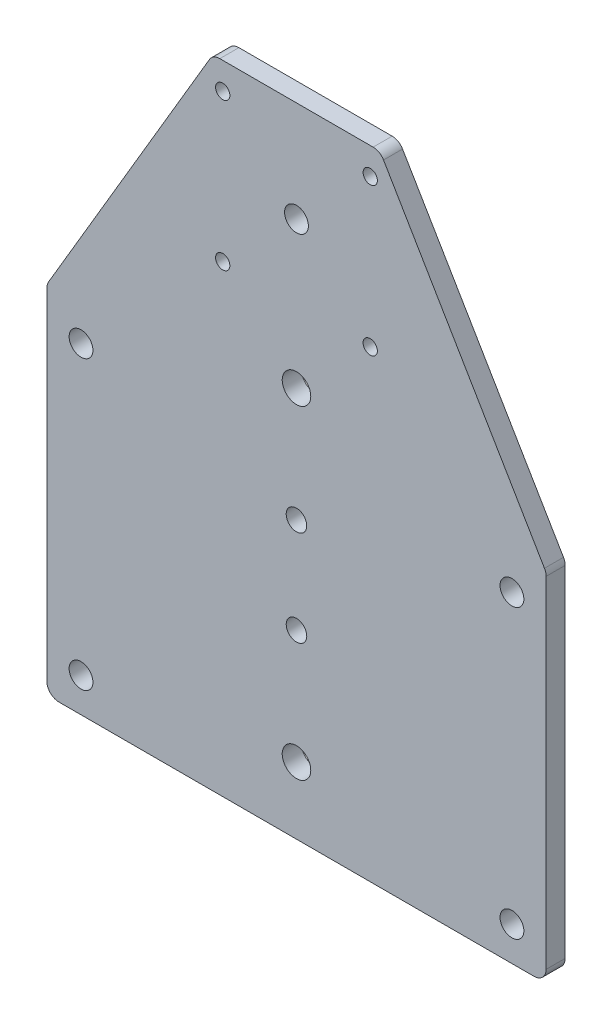
ISO-10303-21;
HEADER;
FILE_DESCRIPTION(('STEP AP214'),'2;1');
FILE_NAME('part.step','',(''),(''),'','','');
FILE_SCHEMA(('AUTOMOTIVE_DESIGN { 1 0 10303 214 1 1 1 1 }'));
ENDSEC;
DATA;
#1=APPLICATION_CONTEXT('core data for automotive mechanical design processes');
#2=APPLICATION_PROTOCOL_DEFINITION('international standard','automotive_design',2000,#1);
#3=PRODUCT_CONTEXT('',#1,'mechanical');
#4=PRODUCT('Part','Part','',(#3));
#5=PRODUCT_RELATED_PRODUCT_CATEGORY('part','',(#4));
#6=PRODUCT_DEFINITION_FORMATION('','',#4);
#7=PRODUCT_DEFINITION_CONTEXT('part definition',#1,'design');
#8=PRODUCT_DEFINITION('design','',#6,#7);
#9=PRODUCT_DEFINITION_SHAPE('','',#8);
#10=(LENGTH_UNIT() NAMED_UNIT(*) SI_UNIT(.MILLI.,.METRE.));
#11=(NAMED_UNIT(*) PLANE_ANGLE_UNIT() SI_UNIT($,.RADIAN.));
#12=(NAMED_UNIT(*) SI_UNIT($,.STERADIAN.) SOLID_ANGLE_UNIT());
#13=UNCERTAINTY_MEASURE_WITH_UNIT(LENGTH_MEASURE(1.E-05),#10,'distance_accuracy_value','');
#14=(GEOMETRIC_REPRESENTATION_CONTEXT(3) GLOBAL_UNCERTAINTY_ASSIGNED_CONTEXT((#13)) GLOBAL_UNIT_ASSIGNED_CONTEXT((#10,
#11,#12)) REPRESENTATION_CONTEXT('',''));
#15=CARTESIAN_POINT('',(0.,0.,0.));
#16=DIRECTION('',(0.,0.,1.));
#17=DIRECTION('',(1.,0.,0.));
#18=AXIS2_PLACEMENT_3D('',#15,#16,#17);
#19=CARTESIAN_POINT('',(0.,0.,4.));
#20=DIRECTION('',(0.,0.,1.));
#21=DIRECTION('',(1.,0.,0.));
#22=AXIS2_PLACEMENT_3D('',#19,#20,#21);
#23=PLANE('',#22);
#24=CARTESIAN_POINT('',(0.,-74.8337421354534,4.));
#25=DIRECTION('',(0.,0.,1.));
#26=DIRECTION('',(1.,0.,0.));
#27=AXIS2_PLACEMENT_3D('',#24,#25,#26);
#28=CIRCLE('',#27,2.15900000000001);
#29=CARTESIAN_POINT('',(2.15900000000001,-74.8337421354534,4.));
#30=VERTEX_POINT('',#29);
#31=EDGE_CURVE('E657',#30,#30,#28,.F.);
#32=ORIENTED_EDGE('',*,*,#31,.T.);
#33=EDGE_LOOP('',(#32));
#34=FACE_BOUND('',#33,.T.);
#35=CARTESIAN_POINT('',(0.,-54.7677421354534,4.));
#36=DIRECTION('',(0.,0.,1.));
#37=DIRECTION('',(1.,0.,0.));
#38=AXIS2_PLACEMENT_3D('',#35,#36,#37);
#39=CIRCLE('',#38,2.15900000000001);
#40=CARTESIAN_POINT('',(2.15900000000001,-54.7677421354534,4.));
#41=VERTEX_POINT('',#40);
#42=EDGE_CURVE('E654',#41,#41,#39,.T.);
#43=ORIENTED_EDGE('',*,*,#42,.F.);
#44=EDGE_LOOP('',(#43));
#45=FACE_BOUND('',#44,.T.);
#46=CARTESIAN_POINT('',(-45.2837421354535,-105.683742135453,4.));
#47=DIRECTION('',(0.,0.,1.));
#48=DIRECTION('',(1.,0.,0.));
#49=AXIS2_PLACEMENT_3D('',#46,#47,#48);
#50=CIRCLE('',#49,2.5);
#51=CARTESIAN_POINT('',(-42.7837421354535,-105.683742135453,4.));
#52=VERTEX_POINT('',#51);
#53=EDGE_CURVE('E214',#52,#52,#50,.F.);
#54=ORIENTED_EDGE('',*,*,#53,.T.);
#55=EDGE_LOOP('',(#54));
#56=FACE_BOUND('',#55,.T.);
#57=CARTESIAN_POINT('',(45.2837421354535,-105.683742135453,4.));
#58=DIRECTION('',(0.,0.,1.));
#59=DIRECTION('',(1.,0.,0.));
#60=AXIS2_PLACEMENT_3D('',#57,#58,#59);
#61=CIRCLE('',#60,2.50000000000002);
#62=CARTESIAN_POINT('',(47.7837421354536,-105.683742135453,4.));
#63=VERTEX_POINT('',#62);
#64=EDGE_CURVE('E322',#63,#63,#61,.T.);
#65=ORIENTED_EDGE('',*,*,#64,.F.);
#66=EDGE_LOOP('',(#65));
#67=FACE_BOUND('',#66,.T.);
#68=CARTESIAN_POINT('',(45.2837421354535,-45.2837421354535,4.));
#69=DIRECTION('',(0.,0.,1.));
#70=DIRECTION('',(1.,0.,0.));
#71=AXIS2_PLACEMENT_3D('',#68,#69,#70);
#72=CIRCLE('',#71,2.50000000000002);
#73=CARTESIAN_POINT('',(47.7837421354536,-45.2837421354535,4.));
#74=VERTEX_POINT('',#73);
#75=EDGE_CURVE('E318',#74,#74,#72,.F.);
#76=ORIENTED_EDGE('',*,*,#75,.T.);
#77=EDGE_LOOP('',(#76));
#78=FACE_BOUND('',#77,.T.);
#79=CARTESIAN_POINT('',(-45.2837421354535,-45.2837421354535,4.));
#80=DIRECTION('',(0.,0.,1.));
#81=DIRECTION('',(1.,0.,0.));
#82=AXIS2_PLACEMENT_3D('',#79,#80,#81);
#83=CIRCLE('',#82,2.5);
#84=CARTESIAN_POINT('',(-42.7837421354535,-45.2837421354535,4.));
#85=VERTEX_POINT('',#84);
#86=EDGE_CURVE('E314',#85,#85,#83,.T.);
#87=ORIENTED_EDGE('',*,*,#86,.F.);
#88=EDGE_LOOP('',(#87));
#89=FACE_BOUND('',#88,.T.);
#90=DIRECTION('',(0.507639890212221,0.861569348262416,0.));
#91=VECTOR('',#90,1.);
#92=CARTESIAN_POINT('',(-22.2835693380345,13.1295626000506,4.));
#93=LINE('',#92,#91);
#94=CARTESIAN_POINT('',(-52.1163331768954,-37.5027761761018,4.));
#95=VERTEX_POINT('',#94);
#96=CARTESIAN_POINT('',(-18.2947526251161,19.899405321139,4.));
#97=VERTEX_POINT('',#96);
#98=EDGE_CURVE('E293',#95,#97,#93,.T.);
#99=ORIENTED_EDGE('',*,*,#98,.F.);
#100=CARTESIAN_POINT('',(-49.9279470323089,-38.7921814972409,4.));
#101=DIRECTION('',(0.,0.,1.));
#102=DIRECTION('',(1.,0.,0.));
#103=AXIS2_PLACEMENT_3D('',#100,#101,#102);
#104=CIRCLE('',#103,2.54);
#105=CARTESIAN_POINT('',(-52.4679470323089,-38.7921814972409,4.));
#106=VERTEX_POINT('',#105);
#107=EDGE_CURVE('E250',#95,#106,#104,.T.);
#108=ORIENTED_EDGE('',*,*,#107,.T.);
#109=DIRECTION('',(0.,-1.,0.));
#110=VECTOR('',#109,1.);
#111=CARTESIAN_POINT('',(-52.4679470323089,0.,4.));
#112=LINE('',#111,#110);
#113=CARTESIAN_POINT('',(-52.4679470323089,-110.327947032309,4.));
#114=VERTEX_POINT('',#113);
#115=EDGE_CURVE('E158',#106,#114,#112,.T.);
#116=ORIENTED_EDGE('',*,*,#115,.T.);
#117=CARTESIAN_POINT('',(-49.9279470323089,-110.327947032309,4.));
#118=DIRECTION('',(0.,0.,1.));
#119=DIRECTION('',(1.,0.,0.));
#120=AXIS2_PLACEMENT_3D('',#117,#118,#119);
#121=CIRCLE('',#120,2.54);
#122=CARTESIAN_POINT('',(-49.9279470323089,-112.867947032309,4.));
#123=VERTEX_POINT('',#122);
#124=EDGE_CURVE('E247',#114,#123,#121,.T.);
#125=ORIENTED_EDGE('',*,*,#124,.T.);
#126=DIRECTION('',(1.,0.,0.));
#127=VECTOR('',#126,1.);
#128=CARTESIAN_POINT('',(0.,-112.867947032309,4.));
#129=LINE('',#128,#127);
#130=CARTESIAN_POINT('',(49.9279470323089,-112.867947032309,4.));
#131=VERTEX_POINT('',#130);
#132=EDGE_CURVE('E308',#123,#131,#129,.T.);
#133=ORIENTED_EDGE('',*,*,#132,.T.);
#134=CARTESIAN_POINT('',(49.9279470323089,-110.327947032309,4.));
#135=DIRECTION('',(0.,0.,1.));
#136=DIRECTION('',(1.,0.,0.));
#137=AXIS2_PLACEMENT_3D('',#134,#135,#136);
#138=CIRCLE('',#137,2.54);
#139=CARTESIAN_POINT('',(52.4679470323089,-110.327947032309,4.));
#140=VERTEX_POINT('',#139);
#141=EDGE_CURVE('E244',#131,#140,#138,.T.);
#142=ORIENTED_EDGE('',*,*,#141,.T.);
#143=DIRECTION('',(0.,-1.,0.));
#144=VECTOR('',#143,1.);
#145=CARTESIAN_POINT('',(52.4679470323089,0.,4.));
#146=LINE('',#145,#144);
#147=CARTESIAN_POINT('',(52.4679470323089,-38.7921814972409,4.));
#148=VERTEX_POINT('',#147);
#149=EDGE_CURVE('E304',#148,#140,#146,.T.);
#150=ORIENTED_EDGE('',*,*,#149,.F.);
#151=CARTESIAN_POINT('',(49.9279470323089,-38.7921814972409,4.));
#152=DIRECTION('',(0.,0.,1.));
#153=DIRECTION('',(1.,0.,0.));
#154=AXIS2_PLACEMENT_3D('',#151,#152,#153);
#155=CIRCLE('',#154,2.54);
#156=CARTESIAN_POINT('',(52.1163331768954,-37.5027761761018,4.));
#157=VERTEX_POINT('',#156);
#158=EDGE_CURVE('E241',#148,#157,#155,.T.);
#159=ORIENTED_EDGE('',*,*,#158,.T.);
#160=DIRECTION('',(0.507639890212221,-0.861569348262416,0.));
#161=VECTOR('',#160,1.);
#162=CARTESIAN_POINT('',(22.2835693380345,13.1295626000506,4.));
#163=LINE('',#162,#161);
#164=CARTESIAN_POINT('',(18.2947526251161,19.899405321139,4.));
#165=VERTEX_POINT('',#164);
#166=EDGE_CURVE('E300',#165,#157,#163,.T.);
#167=ORIENTED_EDGE('',*,*,#166,.F.);
#168=CARTESIAN_POINT('',(16.1063664805295,18.61,4.));
#169=DIRECTION('',(0.,0.,1.));
#170=DIRECTION('',(1.,0.,0.));
#171=AXIS2_PLACEMENT_3D('',#168,#169,#170);
#172=CIRCLE('',#171,2.54);
#173=CARTESIAN_POINT('',(16.1063664805295,21.15,4.));
#174=VERTEX_POINT('',#173);
#175=EDGE_CURVE('E62',#165,#174,#172,.T.);
#176=ORIENTED_EDGE('',*,*,#175,.T.);
#177=DIRECTION('',(1.,0.,0.));
#178=VECTOR('',#177,1.);
#179=CARTESIAN_POINT('',(0.,21.15,4.));
#180=LINE('',#179,#178);
#181=CARTESIAN_POINT('',(-16.1063664805295,21.15,4.));
#182=VERTEX_POINT('',#181);
#183=EDGE_CURVE('E297',#182,#174,#180,.T.);
#184=ORIENTED_EDGE('',*,*,#183,.F.);
#185=CARTESIAN_POINT('',(-16.1063664805295,18.61,4.));
#186=DIRECTION('',(0.,0.,1.));
#187=DIRECTION('',(1.,0.,0.));
#188=AXIS2_PLACEMENT_3D('',#185,#186,#187);
#189=CIRCLE('',#188,2.54);
#190=EDGE_CURVE('E236',#182,#97,#189,.T.);
#191=ORIENTED_EDGE('',*,*,#190,.T.);
#192=EDGE_LOOP('',(#99,#108,#116,#125,#133,#142,#150,#159,#167,#176,#184,#191));
#193=FACE_BOUND('',#192,.T.);
#194=CARTESIAN_POINT('',(0.,0.,4.));
#195=DIRECTION('',(0.,0.,1.));
#196=DIRECTION('',(1.,0.,0.));
#197=AXIS2_PLACEMENT_3D('',#194,#195,#196);
#198=CIRCLE('',#197,2.5);
#199=CARTESIAN_POINT('',(2.50000000000001,0.,4.));
#200=VERTEX_POINT('',#199);
#201=EDGE_CURVE('E289',#200,#200,#198,.T.);
#202=ORIENTED_EDGE('',*,*,#201,.F.);
#203=EDGE_LOOP('',(#202));
#204=FACE_BOUND('',#203,.T.);
#205=CARTESIAN_POINT('',(15.5,-15.5,4.));
#206=DIRECTION('',(0.,0.,1.));
#207=DIRECTION('',(1.,0.,0.));
#208=AXIS2_PLACEMENT_3D('',#205,#206,#207);
#209=CIRCLE('',#208,1.5);
#210=CARTESIAN_POINT('',(17.,-15.5,4.));
#211=VERTEX_POINT('',#210);
#212=EDGE_CURVE('E285',#211,#211,#209,.T.);
#213=ORIENTED_EDGE('',*,*,#212,.F.);
#214=EDGE_LOOP('',(#213));
#215=FACE_BOUND('',#214,.T.);
#216=CARTESIAN_POINT('',(15.5,15.5,4.));
#217=DIRECTION('',(0.,0.,1.));
#218=DIRECTION('',(1.,0.,0.));
#219=AXIS2_PLACEMENT_3D('',#216,#217,#218);
#220=CIRCLE('',#219,1.5);
#221=CARTESIAN_POINT('',(17.,15.5,4.));
#222=VERTEX_POINT('',#221);
#223=EDGE_CURVE('E281',#222,#222,#220,.T.);
#224=ORIENTED_EDGE('',*,*,#223,.F.);
#225=EDGE_LOOP('',(#224));
#226=FACE_BOUND('',#225,.T.);
#227=CARTESIAN_POINT('',(-15.5,15.5,4.));
#228=DIRECTION('',(0.,0.,1.));
#229=DIRECTION('',(1.,0.,0.));
#230=AXIS2_PLACEMENT_3D('',#227,#228,#229);
#231=CIRCLE('',#230,1.5);
#232=CARTESIAN_POINT('',(-14.,15.5,4.));
#233=VERTEX_POINT('',#232);
#234=EDGE_CURVE('E277',#233,#233,#231,.T.);
#235=ORIENTED_EDGE('',*,*,#234,.F.);
#236=EDGE_LOOP('',(#235));
#237=FACE_BOUND('',#236,.T.);
#238=CARTESIAN_POINT('',(-15.5,-15.5,4.));
#239=DIRECTION('',(0.,0.,1.));
#240=DIRECTION('',(1.,0.,0.));
#241=AXIS2_PLACEMENT_3D('',#238,#239,#240);
#242=CIRCLE('',#241,1.5);
#243=CARTESIAN_POINT('',(-14.,-15.5,4.));
#244=VERTEX_POINT('',#243);
#245=EDGE_CURVE('E216',#244,#244,#242,.T.);
#246=ORIENTED_EDGE('',*,*,#245,.F.);
#247=EDGE_LOOP('',(#246));
#248=FACE_BOUND('',#247,.T.);
#249=CARTESIAN_POINT('',(0.,-30.7677421354534,4.));
#250=DIRECTION('',(0.,0.,1.));
#251=DIRECTION('',(1.,0.,0.));
#252=AXIS2_PLACEMENT_3D('',#249,#250,#251);
#253=CIRCLE('',#252,3.);
#254=CARTESIAN_POINT('',(3.,-30.7677421354534,4.));
#255=VERTEX_POINT('',#254);
#256=EDGE_CURVE('E638',#255,#255,#253,.T.);
#257=ORIENTED_EDGE('',*,*,#256,.F.);
#258=EDGE_LOOP('',(#257));
#259=FACE_BOUND('',#258,.T.);
#260=CARTESIAN_POINT('',(0.,-98.8337421354535,4.));
#261=DIRECTION('',(0.,0.,1.));
#262=DIRECTION('',(1.,0.,0.));
#263=AXIS2_PLACEMENT_3D('',#260,#261,#262);
#264=CIRCLE('',#263,3.);
#265=CARTESIAN_POINT('',(3.,-98.8337421354535,4.));
#266=VERTEX_POINT('',#265);
#267=EDGE_CURVE('E641',#266,#266,#264,.F.);
#268=ORIENTED_EDGE('',*,*,#267,.T.);
#269=EDGE_LOOP('',(#268));
#270=FACE_BOUND('',#269,.T.);
#271=ADVANCED_FACE('F46',(#34,#45,#56,#67,#78,#89,#193,#204,#215,#226,#237,#248,#259,#270),#23,.T.);
#272=CARTESIAN_POINT('',(0.,0.,0.));
#273=DIRECTION('',(0.,0.,1.));
#274=DIRECTION('',(1.,0.,0.));
#275=AXIS2_PLACEMENT_3D('',#272,#273,#274);
#276=PLANE('',#275);
#277=CARTESIAN_POINT('',(0.,-30.7677421354534,0.));
#278=DIRECTION('',(0.,0.,1.));
#279=DIRECTION('',(1.,0.,0.));
#280=AXIS2_PLACEMENT_3D('',#277,#278,#279);
#281=CIRCLE('',#280,3.);
#282=CARTESIAN_POINT('',(3.,-30.7677421354534,0.));
#283=VERTEX_POINT('',#282);
#284=EDGE_CURVE('E644',#283,#283,#281,.F.);
#285=ORIENTED_EDGE('',*,*,#284,.F.);
#286=EDGE_LOOP('',(#285));
#287=FACE_BOUND('',#286,.T.);
#288=CARTESIAN_POINT('',(0.,-54.7677421354534,0.));
#289=DIRECTION('',(0.,0.,1.));
#290=DIRECTION('',(1.,0.,0.));
#291=AXIS2_PLACEMENT_3D('',#288,#289,#290);
#292=CIRCLE('',#291,2.15900000000001);
#293=CARTESIAN_POINT('',(2.15900000000001,-54.7677421354534,0.));
#294=VERTEX_POINT('',#293);
#295=EDGE_CURVE('E332',#294,#294,#292,.F.);
#296=ORIENTED_EDGE('',*,*,#295,.F.);
#297=EDGE_LOOP('',(#296));
#298=FACE_BOUND('',#297,.T.);
#299=CARTESIAN_POINT('',(-45.2837421354535,-105.683742135453,0.));
#300=DIRECTION('',(0.,0.,1.));
#301=DIRECTION('',(1.,0.,0.));
#302=AXIS2_PLACEMENT_3D('',#299,#300,#301);
#303=CIRCLE('',#302,2.5);
#304=CARTESIAN_POINT('',(-42.7837421354535,-105.683742135453,0.));
#305=VERTEX_POINT('',#304);
#306=EDGE_CURVE('E335',#305,#305,#303,.F.);
#307=ORIENTED_EDGE('',*,*,#306,.F.);
#308=EDGE_LOOP('',(#307));
#309=FACE_BOUND('',#308,.T.);
#310=CARTESIAN_POINT('',(45.2837421354535,-105.683742135453,0.));
#311=DIRECTION('',(0.,0.,1.));
#312=DIRECTION('',(1.,0.,0.));
#313=AXIS2_PLACEMENT_3D('',#310,#311,#312);
#314=CIRCLE('',#313,2.50000000000002);
#315=CARTESIAN_POINT('',(47.7837421354536,-105.683742135453,0.));
#316=VERTEX_POINT('',#315);
#317=EDGE_CURVE('E339',#316,#316,#314,.T.);
#318=ORIENTED_EDGE('',*,*,#317,.T.);
#319=EDGE_LOOP('',(#318));
#320=FACE_BOUND('',#319,.T.);
#321=CARTESIAN_POINT('',(45.2837421354535,-45.2837421354535,0.));
#322=DIRECTION('',(0.,0.,1.));
#323=DIRECTION('',(1.,0.,0.));
#324=AXIS2_PLACEMENT_3D('',#321,#322,#323);
#325=CIRCLE('',#324,2.50000000000002);
#326=CARTESIAN_POINT('',(47.7837421354536,-45.2837421354535,0.));
#327=VERTEX_POINT('',#326);
#328=EDGE_CURVE('E176',#327,#327,#325,.F.);
#329=ORIENTED_EDGE('',*,*,#328,.F.);
#330=EDGE_LOOP('',(#329));
#331=FACE_BOUND('',#330,.T.);
#332=CARTESIAN_POINT('',(-45.2837421354535,-45.2837421354535,0.));
#333=DIRECTION('',(0.,0.,1.));
#334=DIRECTION('',(1.,0.,0.));
#335=AXIS2_PLACEMENT_3D('',#332,#333,#334);
#336=CIRCLE('',#335,2.5);
#337=CARTESIAN_POINT('',(-42.7837421354535,-45.2837421354535,0.));
#338=VERTEX_POINT('',#337);
#339=EDGE_CURVE('E168',#338,#338,#336,.T.);
#340=ORIENTED_EDGE('',*,*,#339,.T.);
#341=EDGE_LOOP('',(#340));
#342=FACE_BOUND('',#341,.T.);
#343=DIRECTION('',(0.,-1.,0.));
#344=VECTOR('',#343,1.);
#345=CARTESIAN_POINT('',(-52.4679470323089,0.,0.));
#346=LINE('',#345,#344);
#347=CARTESIAN_POINT('',(-52.4679470323089,-38.7921814972409,0.));
#348=VERTEX_POINT('',#347);
#349=CARTESIAN_POINT('',(-52.4679470323089,-110.327947032309,0.));
#350=VERTEX_POINT('',#349);
#351=EDGE_CURVE('E155',#348,#350,#346,.T.);
#352=ORIENTED_EDGE('',*,*,#351,.F.);
#353=CARTESIAN_POINT('',(-49.9279470323089,-38.7921814972409,0.));
#354=DIRECTION('',(0.,0.,1.));
#355=DIRECTION('',(1.,0.,0.));
#356=AXIS2_PLACEMENT_3D('',#353,#354,#355);
#357=CIRCLE('',#356,2.54);
#358=CARTESIAN_POINT('',(-52.1163331768954,-37.5027761761018,0.));
#359=VERTEX_POINT('',#358);
#360=EDGE_CURVE('E137',#348,#359,#357,.F.);
#361=ORIENTED_EDGE('',*,*,#360,.T.);
#362=DIRECTION('',(0.507639890212221,0.861569348262416,0.));
#363=VECTOR('',#362,1.);
#364=CARTESIAN_POINT('',(-22.2835693380345,13.1295626000506,0.));
#365=LINE('',#364,#363);
#366=CARTESIAN_POINT('',(-18.2947526251161,19.899405321139,0.));
#367=VERTEX_POINT('',#366);
#368=EDGE_CURVE('E191',#359,#367,#365,.T.);
#369=ORIENTED_EDGE('',*,*,#368,.T.);
#370=CARTESIAN_POINT('',(-16.1063664805295,18.61,0.));
#371=DIRECTION('',(0.,0.,1.));
#372=DIRECTION('',(1.,0.,0.));
#373=AXIS2_PLACEMENT_3D('',#370,#371,#372);
#374=CIRCLE('',#373,2.54);
#375=CARTESIAN_POINT('',(-16.1063664805295,21.15,0.));
#376=VERTEX_POINT('',#375);
#377=EDGE_CURVE('E160',#367,#376,#374,.F.);
#378=ORIENTED_EDGE('',*,*,#377,.T.);
#379=DIRECTION('',(1.,0.,0.));
#380=VECTOR('',#379,1.);
#381=CARTESIAN_POINT('',(0.,21.15,0.));
#382=LINE('',#381,#380);
#383=CARTESIAN_POINT('',(16.1063664805295,21.15,0.));
#384=VERTEX_POINT('',#383);
#385=EDGE_CURVE('E187',#376,#384,#382,.T.);
#386=ORIENTED_EDGE('',*,*,#385,.T.);
#387=CARTESIAN_POINT('',(16.1063664805295,18.61,0.));
#388=DIRECTION('',(0.,0.,1.));
#389=DIRECTION('',(1.,0.,0.));
#390=AXIS2_PLACEMENT_3D('',#387,#388,#389);
#391=CIRCLE('',#390,2.54);
#392=CARTESIAN_POINT('',(18.2947526251161,19.899405321139,0.));
#393=VERTEX_POINT('',#392);
#394=EDGE_CURVE('E220',#384,#393,#391,.F.);
#395=ORIENTED_EDGE('',*,*,#394,.T.);
#396=DIRECTION('',(0.507639890212221,-0.861569348262416,0.));
#397=VECTOR('',#396,1.);
#398=CARTESIAN_POINT('',(22.2835693380345,13.1295626000506,0.));
#399=LINE('',#398,#397);
#400=CARTESIAN_POINT('',(52.1163331768954,-37.5027761761018,0.));
#401=VERTEX_POINT('',#400);
#402=EDGE_CURVE('E183',#393,#401,#399,.T.);
#403=ORIENTED_EDGE('',*,*,#402,.T.);
#404=CARTESIAN_POINT('',(49.9279470323089,-38.7921814972409,0.));
#405=DIRECTION('',(0.,0.,1.));
#406=DIRECTION('',(1.,0.,0.));
#407=AXIS2_PLACEMENT_3D('',#404,#405,#406);
#408=CIRCLE('',#407,2.54);
#409=CARTESIAN_POINT('',(52.4679470323089,-38.7921814972409,0.));
#410=VERTEX_POINT('',#409);
#411=EDGE_CURVE('E223',#401,#410,#408,.F.);
#412=ORIENTED_EDGE('',*,*,#411,.T.);
#413=DIRECTION('',(0.,-1.,0.));
#414=VECTOR('',#413,1.);
#415=CARTESIAN_POINT('',(52.4679470323089,0.,0.));
#416=LINE('',#415,#414);
#417=CARTESIAN_POINT('',(52.4679470323089,-110.327947032309,0.));
#418=VERTEX_POINT('',#417);
#419=EDGE_CURVE('E173',#410,#418,#416,.T.);
#420=ORIENTED_EDGE('',*,*,#419,.T.);
#421=CARTESIAN_POINT('',(49.9279470323089,-110.327947032309,0.));
#422=DIRECTION('',(0.,0.,1.));
#423=DIRECTION('',(1.,0.,0.));
#424=AXIS2_PLACEMENT_3D('',#421,#422,#423);
#425=CIRCLE('',#424,2.54);
#426=CARTESIAN_POINT('',(49.9279470323089,-112.867947032309,0.));
#427=VERTEX_POINT('',#426);
#428=EDGE_CURVE('E226',#418,#427,#425,.F.);
#429=ORIENTED_EDGE('',*,*,#428,.T.);
#430=DIRECTION('',(1.,0.,0.));
#431=VECTOR('',#430,1.);
#432=CARTESIAN_POINT('',(0.,-112.867947032309,0.));
#433=LINE('',#432,#431);
#434=CARTESIAN_POINT('',(-49.9279470323089,-112.867947032309,0.));
#435=VERTEX_POINT('',#434);
#436=EDGE_CURVE('E167',#435,#427,#433,.T.);
#437=ORIENTED_EDGE('',*,*,#436,.F.);
#438=CARTESIAN_POINT('',(-49.9279470323089,-110.327947032309,0.));
#439=DIRECTION('',(0.,0.,1.));
#440=DIRECTION('',(1.,0.,0.));
#441=AXIS2_PLACEMENT_3D('',#438,#439,#440);
#442=CIRCLE('',#441,2.54);
#443=EDGE_CURVE('E149',#435,#350,#442,.F.);
#444=ORIENTED_EDGE('',*,*,#443,.T.);
#445=EDGE_LOOP('',(#352,#361,#369,#378,#386,#395,#403,#412,#420,#429,#437,#444));
#446=FACE_BOUND('',#445,.T.);
#447=CARTESIAN_POINT('',(0.,0.,0.));
#448=DIRECTION('',(0.,0.,1.));
#449=DIRECTION('',(1.,0.,0.));
#450=AXIS2_PLACEMENT_3D('',#447,#448,#449);
#451=CIRCLE('',#450,2.5);
#452=CARTESIAN_POINT('',(2.50000000000001,0.,0.));
#453=VERTEX_POINT('',#452);
#454=EDGE_CURVE('E194',#453,#453,#451,.T.);
#455=ORIENTED_EDGE('',*,*,#454,.T.);
#456=EDGE_LOOP('',(#455));
#457=FACE_BOUND('',#456,.T.);
#458=CARTESIAN_POINT('',(15.5,-15.5,0.));
#459=DIRECTION('',(0.,0.,1.));
#460=DIRECTION('',(1.,0.,0.));
#461=AXIS2_PLACEMENT_3D('',#458,#459,#460);
#462=CIRCLE('',#461,1.5);
#463=CARTESIAN_POINT('',(17.,-15.5,0.));
#464=VERTEX_POINT('',#463);
#465=EDGE_CURVE('E198',#464,#464,#462,.T.);
#466=ORIENTED_EDGE('',*,*,#465,.T.);
#467=EDGE_LOOP('',(#466));
#468=FACE_BOUND('',#467,.T.);
#469=CARTESIAN_POINT('',(15.5,15.5,0.));
#470=DIRECTION('',(0.,0.,1.));
#471=DIRECTION('',(1.,0.,0.));
#472=AXIS2_PLACEMENT_3D('',#469,#470,#471);
#473=CIRCLE('',#472,1.5);
#474=CARTESIAN_POINT('',(17.,15.5,0.));
#475=VERTEX_POINT('',#474);
#476=EDGE_CURVE('E202',#475,#475,#473,.T.);
#477=ORIENTED_EDGE('',*,*,#476,.T.);
#478=EDGE_LOOP('',(#477));
#479=FACE_BOUND('',#478,.T.);
#480=CARTESIAN_POINT('',(-15.5,15.5,0.));
#481=DIRECTION('',(0.,0.,1.));
#482=DIRECTION('',(1.,0.,0.));
#483=AXIS2_PLACEMENT_3D('',#480,#481,#482);
#484=CIRCLE('',#483,1.5);
#485=CARTESIAN_POINT('',(-14.,15.5,0.));
#486=VERTEX_POINT('',#485);
#487=EDGE_CURVE('E206',#486,#486,#484,.T.);
#488=ORIENTED_EDGE('',*,*,#487,.T.);
#489=EDGE_LOOP('',(#488));
#490=FACE_BOUND('',#489,.T.);
#491=CARTESIAN_POINT('',(-15.5,-15.5,0.));
#492=DIRECTION('',(0.,0.,1.));
#493=DIRECTION('',(1.,0.,0.));
#494=AXIS2_PLACEMENT_3D('',#491,#492,#493);
#495=CIRCLE('',#494,1.5);
#496=CARTESIAN_POINT('',(-14.,-15.5,0.));
#497=VERTEX_POINT('',#496);
#498=EDGE_CURVE('E210',#497,#497,#495,.T.);
#499=ORIENTED_EDGE('',*,*,#498,.T.);
#500=EDGE_LOOP('',(#499));
#501=FACE_BOUND('',#500,.T.);
#502=CARTESIAN_POINT('',(0.,-74.8337421354534,0.));
#503=DIRECTION('',(0.,0.,1.));
#504=DIRECTION('',(1.,0.,0.));
#505=AXIS2_PLACEMENT_3D('',#502,#503,#504);
#506=CIRCLE('',#505,2.15900000000001);
#507=CARTESIAN_POINT('',(2.15900000000001,-74.8337421354534,0.));
#508=VERTEX_POINT('',#507);
#509=EDGE_CURVE('E663',#508,#508,#506,.T.);
#510=ORIENTED_EDGE('',*,*,#509,.T.);
#511=EDGE_LOOP('',(#510));
#512=FACE_BOUND('',#511,.T.);
#513=CARTESIAN_POINT('',(0.,-98.8337421354535,0.));
#514=DIRECTION('',(0.,0.,1.));
#515=DIRECTION('',(1.,0.,0.));
#516=AXIS2_PLACEMENT_3D('',#513,#514,#515);
#517=CIRCLE('',#516,3.);
#518=CARTESIAN_POINT('',(3.,-98.8337421354535,0.));
#519=VERTEX_POINT('',#518);
#520=EDGE_CURVE('E645',#519,#519,#517,.T.);
#521=ORIENTED_EDGE('',*,*,#520,.T.);
#522=EDGE_LOOP('',(#521));
#523=FACE_BOUND('',#522,.T.);
#524=ADVANCED_FACE('F163',(#287,#298,#309,#320,#331,#342,#446,#457,#468,#479,#490,#501,#512,
#523),#276,.F.);
#525=CARTESIAN_POINT('',(-52.4679470323089,0.,4.));
#526=DIRECTION('',(1.,0.,0.));
#527=DIRECTION('',(0.,1.,0.));
#528=AXIS2_PLACEMENT_3D('',#525,#526,#527);
#529=PLANE('',#528);
#530=ORIENTED_EDGE('',*,*,#115,.F.);
#531=DIRECTION('',(0.,0.,-1.));
#532=VECTOR('',#531,1.);
#533=CARTESIAN_POINT('',(-52.4679470323089,-38.7921814972409,0.));
#534=LINE('',#533,#532);
#535=EDGE_CURVE('E141',#106,#348,#534,.T.);
#536=ORIENTED_EDGE('',*,*,#535,.T.);
#537=ORIENTED_EDGE('',*,*,#351,.T.);
#538=DIRECTION('',(0.,0.,-1.));
#539=VECTOR('',#538,1.);
#540=CARTESIAN_POINT('',(-52.4679470323089,-110.327947032309,4.));
#541=LINE('',#540,#539);
#542=EDGE_CURVE('E161',#350,#114,#541,.F.);
#543=ORIENTED_EDGE('',*,*,#542,.T.);
#544=EDGE_LOOP('',(#530,#536,#537,#543));
#545=FACE_BOUND('',#544,.T.);
#546=ADVANCED_FACE('F154',(#545),#529,.F.);
#547=CARTESIAN_POINT('',(0.,-112.867947032309,4.));
#548=DIRECTION('',(0.,1.,0.));
#549=DIRECTION('',(-1.,0.,0.));
#550=AXIS2_PLACEMENT_3D('',#547,#548,#549);
#551=PLANE('',#550);
#552=ORIENTED_EDGE('',*,*,#132,.F.);
#553=DIRECTION('',(0.,0.,-1.));
#554=VECTOR('',#553,1.);
#555=CARTESIAN_POINT('',(-49.9279470323089,-112.867947032309,4.));
#556=LINE('',#555,#554);
#557=EDGE_CURVE('E256',#123,#435,#556,.T.);
#558=ORIENTED_EDGE('',*,*,#557,.T.);
#559=ORIENTED_EDGE('',*,*,#436,.T.);
#560=DIRECTION('',(0.,0.,-1.));
#561=VECTOR('',#560,1.);
#562=CARTESIAN_POINT('',(49.9279470323089,-112.867947032309,4.));
#563=LINE('',#562,#561);
#564=EDGE_CURVE('E253',#427,#131,#563,.F.);
#565=ORIENTED_EDGE('',*,*,#564,.T.);
#566=EDGE_LOOP('',(#552,#558,#559,#565));
#567=FACE_BOUND('',#566,.T.);
#568=ADVANCED_FACE('F412',(#567),#551,.F.);
#569=CARTESIAN_POINT('',(52.4679470323089,0.,4.));
#570=DIRECTION('',(1.,0.,0.));
#571=DIRECTION('',(0.,0.,-1.));
#572=AXIS2_PLACEMENT_3D('',#569,#570,#571);
#573=PLANE('',#572);
#574=ORIENTED_EDGE('',*,*,#149,.T.);
#575=DIRECTION('',(0.,0.,-1.));
#576=VECTOR('',#575,1.);
#577=CARTESIAN_POINT('',(52.4679470323089,-110.327947032309,0.));
#578=LINE('',#577,#576);
#579=EDGE_CURVE('E263',#140,#418,#578,.T.);
#580=ORIENTED_EDGE('',*,*,#579,.T.);
#581=ORIENTED_EDGE('',*,*,#419,.F.);
#582=DIRECTION('',(0.,0.,-1.));
#583=VECTOR('',#582,1.);
#584=CARTESIAN_POINT('',(52.4679470323089,-38.7921814972409,4.));
#585=LINE('',#584,#583);
#586=EDGE_CURVE('E260',#410,#148,#585,.F.);
#587=ORIENTED_EDGE('',*,*,#586,.T.);
#588=EDGE_LOOP('',(#574,#580,#581,#587));
#589=FACE_BOUND('',#588,.T.);
#590=ADVANCED_FACE('F408',(#589),#573,.T.);
#591=CARTESIAN_POINT('',(22.2835693380345,13.1295626000506,4.));
#592=DIRECTION('',(0.861569348262416,0.507639890212221,0.));
#593=DIRECTION('',(-0.507639890212221,0.861569348262416,0.));
#594=AXIS2_PLACEMENT_3D('',#591,#592,#593);
#595=PLANE('',#594);
#596=ORIENTED_EDGE('',*,*,#166,.T.);
#597=DIRECTION('',(0.,0.,-1.));
#598=VECTOR('',#597,1.);
#599=CARTESIAN_POINT('',(52.1163331768954,-37.5027761761018,4.));
#600=LINE('',#599,#598);
#601=EDGE_CURVE('E270',#157,#401,#600,.T.);
#602=ORIENTED_EDGE('',*,*,#601,.T.);
#603=ORIENTED_EDGE('',*,*,#402,.F.);
#604=DIRECTION('',(0.,0.,-1.));
#605=VECTOR('',#604,1.);
#606=CARTESIAN_POINT('',(18.2947526251161,19.899405321139,4.));
#607=LINE('',#606,#605);
#608=EDGE_CURVE('E267',#393,#165,#607,.F.);
#609=ORIENTED_EDGE('',*,*,#608,.T.);
#610=EDGE_LOOP('',(#596,#602,#603,#609));
#611=FACE_BOUND('',#610,.T.);
#612=ADVANCED_FACE('F405',(#611),#595,.T.);
#613=CARTESIAN_POINT('',(0.,21.15,4.));
#614=DIRECTION('',(0.,1.,0.));
#615=DIRECTION('',(0.,0.,1.));
#616=AXIS2_PLACEMENT_3D('',#613,#614,#615);
#617=PLANE('',#616);
#618=ORIENTED_EDGE('',*,*,#183,.T.);
#619=DIRECTION('',(0.,0.,-1.));
#620=VECTOR('',#619,1.);
#621=CARTESIAN_POINT('',(16.1063664805295,21.15,4.));
#622=LINE('',#621,#620);
#623=EDGE_CURVE('E11',#174,#384,#622,.T.);
#624=ORIENTED_EDGE('',*,*,#623,.T.);
#625=ORIENTED_EDGE('',*,*,#385,.F.);
#626=DIRECTION('',(0.,0.,-1.));
#627=VECTOR('',#626,1.);
#628=CARTESIAN_POINT('',(-16.1063664805295,21.15,4.));
#629=LINE('',#628,#627);
#630=EDGE_CURVE('E55',#376,#182,#629,.F.);
#631=ORIENTED_EDGE('',*,*,#630,.T.);
#632=EDGE_LOOP('',(#618,#624,#625,#631));
#633=FACE_BOUND('',#632,.T.);
#634=ADVANCED_FACE('F392',(#633),#617,.T.);
#635=CARTESIAN_POINT('',(-15.5,15.5,4.));
#636=DIRECTION('',(0.,0.,-1.));
#637=DIRECTION('',(-1.,0.,0.));
#638=AXIS2_PLACEMENT_3D('',#635,#636,#637);
#639=CYLINDRICAL_SURFACE('',#638,1.5);
#640=ORIENTED_EDGE('',*,*,#234,.T.);
#641=EDGE_LOOP('',(#640));
#642=FACE_BOUND('',#641,.T.);
#643=ORIENTED_EDGE('',*,*,#487,.F.);
#644=EDGE_LOOP('',(#643));
#645=FACE_BOUND('',#644,.T.);
#646=ADVANCED_FACE('F388',(#642,#645),#639,.F.);
#647=CARTESIAN_POINT('',(15.5,15.5,4.));
#648=DIRECTION('',(0.,0.,-1.));
#649=DIRECTION('',(-1.,0.,0.));
#650=AXIS2_PLACEMENT_3D('',#647,#648,#649);
#651=CYLINDRICAL_SURFACE('',#650,1.5);
#652=ORIENTED_EDGE('',*,*,#223,.T.);
#653=EDGE_LOOP('',(#652));
#654=FACE_BOUND('',#653,.T.);
#655=ORIENTED_EDGE('',*,*,#476,.F.);
#656=EDGE_LOOP('',(#655));
#657=FACE_BOUND('',#656,.T.);
#658=ADVANCED_FACE('F391',(#654,#657),#651,.F.);
#659=CARTESIAN_POINT('',(15.5,-15.5,4.));
#660=DIRECTION('',(0.,0.,-1.));
#661=DIRECTION('',(-1.,0.,0.));
#662=AXIS2_PLACEMENT_3D('',#659,#660,#661);
#663=CYLINDRICAL_SURFACE('',#662,1.5);
#664=ORIENTED_EDGE('',*,*,#212,.T.);
#665=EDGE_LOOP('',(#664));
#666=FACE_BOUND('',#665,.T.);
#667=ORIENTED_EDGE('',*,*,#465,.F.);
#668=EDGE_LOOP('',(#667));
#669=FACE_BOUND('',#668,.T.);
#670=ADVANCED_FACE('F396',(#666,#669),#663,.F.);
#671=CARTESIAN_POINT('',(0.,0.,4.));
#672=DIRECTION('',(0.,0.,-1.));
#673=DIRECTION('',(-1.,0.,0.));
#674=AXIS2_PLACEMENT_3D('',#671,#672,#673);
#675=CYLINDRICAL_SURFACE('',#674,2.5);
#676=ORIENTED_EDGE('',*,*,#201,.T.);
#677=EDGE_LOOP('',(#676));
#678=FACE_BOUND('',#677,.T.);
#679=ORIENTED_EDGE('',*,*,#454,.F.);
#680=EDGE_LOOP('',(#679));
#681=FACE_BOUND('',#680,.T.);
#682=ADVANCED_FACE('F367',(#678,#681),#675,.F.);
#683=CARTESIAN_POINT('',(-22.2835693380345,13.1295626000506,4.));
#684=DIRECTION('',(-0.861569348262416,0.507639890212221,0.));
#685=DIRECTION('',(-0.507639890212221,-0.861569348262416,0.));
#686=AXIS2_PLACEMENT_3D('',#683,#684,#685);
#687=PLANE('',#686);
#688=ORIENTED_EDGE('',*,*,#368,.F.);
#689=DIRECTION('',(0.,0.,-1.));
#690=VECTOR('',#689,1.);
#691=CARTESIAN_POINT('',(-52.1163331768954,-37.5027761761018,4.));
#692=LINE('',#691,#690);
#693=EDGE_CURVE('E142',#359,#95,#692,.F.);
#694=ORIENTED_EDGE('',*,*,#693,.T.);
#695=ORIENTED_EDGE('',*,*,#98,.T.);
#696=DIRECTION('',(0.,0.,-1.));
#697=VECTOR('',#696,1.);
#698=CARTESIAN_POINT('',(-18.2947526251161,19.899405321139,4.));
#699=LINE('',#698,#697);
#700=EDGE_CURVE('E148',#97,#367,#699,.T.);
#701=ORIENTED_EDGE('',*,*,#700,.T.);
#702=EDGE_LOOP('',(#688,#694,#695,#701));
#703=FACE_BOUND('',#702,.T.);
#704=ADVANCED_FACE('F356',(#703),#687,.T.);
#705=CARTESIAN_POINT('',(-45.2837421354535,-45.2837421354535,4.));
#706=DIRECTION('',(0.,0.,-1.));
#707=DIRECTION('',(-1.,0.,0.));
#708=AXIS2_PLACEMENT_3D('',#705,#706,#707);
#709=CYLINDRICAL_SURFACE('',#708,2.5);
#710=ORIENTED_EDGE('',*,*,#86,.T.);
#711=EDGE_LOOP('',(#710));
#712=FACE_BOUND('',#711,.T.);
#713=ORIENTED_EDGE('',*,*,#339,.F.);
#714=EDGE_LOOP('',(#713));
#715=FACE_BOUND('',#714,.T.);
#716=ADVANCED_FACE('F354',(#712,#715),#709,.F.);
#717=CARTESIAN_POINT('',(45.2837421354535,-45.2837421354535,4.));
#718=DIRECTION('',(0.,0.,-1.));
#719=DIRECTION('',(-1.,0.,0.));
#720=AXIS2_PLACEMENT_3D('',#717,#718,#719);
#721=CYLINDRICAL_SURFACE('',#720,2.50000000000002);
#722=ORIENTED_EDGE('',*,*,#75,.F.);
#723=EDGE_LOOP('',(#722));
#724=FACE_BOUND('',#723,.T.);
#725=ORIENTED_EDGE('',*,*,#328,.T.);
#726=EDGE_LOOP('',(#725));
#727=FACE_BOUND('',#726,.T.);
#728=ADVANCED_FACE('F346',(#724,#727),#721,.F.);
#729=CARTESIAN_POINT('',(45.2837421354535,-105.683742135453,4.));
#730=DIRECTION('',(0.,0.,-1.));
#731=DIRECTION('',(-1.,0.,0.));
#732=AXIS2_PLACEMENT_3D('',#729,#730,#731);
#733=CYLINDRICAL_SURFACE('',#732,2.50000000000002);
#734=ORIENTED_EDGE('',*,*,#64,.T.);
#735=EDGE_LOOP('',(#734));
#736=FACE_BOUND('',#735,.T.);
#737=ORIENTED_EDGE('',*,*,#317,.F.);
#738=EDGE_LOOP('',(#737));
#739=FACE_BOUND('',#738,.T.);
#740=ADVANCED_FACE('F363',(#736,#739),#733,.F.);
#741=CARTESIAN_POINT('',(-45.2837421354535,-105.683742135453,4.));
#742=DIRECTION('',(0.,0.,-1.));
#743=DIRECTION('',(-1.,0.,0.));
#744=AXIS2_PLACEMENT_3D('',#741,#742,#743);
#745=CYLINDRICAL_SURFACE('',#744,2.5);
#746=ORIENTED_EDGE('',*,*,#53,.F.);
#747=EDGE_LOOP('',(#746));
#748=FACE_BOUND('',#747,.T.);
#749=ORIENTED_EDGE('',*,*,#306,.T.);
#750=EDGE_LOOP('',(#749));
#751=FACE_BOUND('',#750,.T.);
#752=ADVANCED_FACE('F386',(#748,#751),#745,.F.);
#753=CARTESIAN_POINT('',(-15.5,-15.5,4.));
#754=DIRECTION('',(0.,0.,-1.));
#755=DIRECTION('',(-1.,0.,0.));
#756=AXIS2_PLACEMENT_3D('',#753,#754,#755);
#757=CYLINDRICAL_SURFACE('',#756,1.5);
#758=ORIENTED_EDGE('',*,*,#245,.T.);
#759=EDGE_LOOP('',(#758));
#760=FACE_BOUND('',#759,.T.);
#761=ORIENTED_EDGE('',*,*,#498,.F.);
#762=EDGE_LOOP('',(#761));
#763=FACE_BOUND('',#762,.T.);
#764=ADVANCED_FACE('F383',(#760,#763),#757,.F.);
#765=CARTESIAN_POINT('',(0.,-54.7677421354534,-8.48528137423858));
#766=DIRECTION('',(0.,0.,1.));
#767=DIRECTION('',(1.,0.,0.));
#768=AXIS2_PLACEMENT_3D('',#765,#766,#767);
#769=CYLINDRICAL_SURFACE('',#768,2.15900000000001);
#770=ORIENTED_EDGE('',*,*,#295,.T.);
#771=EDGE_LOOP('',(#770));
#772=FACE_BOUND('',#771,.T.);
#773=ORIENTED_EDGE('',*,*,#42,.T.);
#774=EDGE_LOOP('',(#773));
#775=FACE_BOUND('',#774,.T.);
#776=ADVANCED_FACE('F380',(#772,#775),#769,.F.);
#777=CARTESIAN_POINT('',(0.,-74.8337421354534,-8.48528137423858));
#778=DIRECTION('',(0.,0.,1.));
#779=DIRECTION('',(1.,0.,0.));
#780=AXIS2_PLACEMENT_3D('',#777,#778,#779);
#781=CYLINDRICAL_SURFACE('',#780,2.15900000000001);
#782=ORIENTED_EDGE('',*,*,#509,.F.);
#783=EDGE_LOOP('',(#782));
#784=FACE_BOUND('',#783,.T.);
#785=ORIENTED_EDGE('',*,*,#31,.F.);
#786=EDGE_LOOP('',(#785));
#787=FACE_BOUND('',#786,.T.);
#788=ADVANCED_FACE('F519',(#784,#787),#781,.F.);
#789=CARTESIAN_POINT('',(0.,-30.7677421354534,-8.48528137423858));
#790=DIRECTION('',(0.,0.,1.));
#791=DIRECTION('',(1.,0.,0.));
#792=AXIS2_PLACEMENT_3D('',#789,#790,#791);
#793=CYLINDRICAL_SURFACE('',#792,3.);
#794=ORIENTED_EDGE('',*,*,#284,.T.);
#795=EDGE_LOOP('',(#794));
#796=FACE_BOUND('',#795,.T.);
#797=ORIENTED_EDGE('',*,*,#256,.T.);
#798=EDGE_LOOP('',(#797));
#799=FACE_BOUND('',#798,.T.);
#800=ADVANCED_FACE('F511',(#796,#799),#793,.F.);
#801=CARTESIAN_POINT('',(0.,-98.8337421354535,-8.48528137423858));
#802=DIRECTION('',(0.,0.,1.));
#803=DIRECTION('',(1.,0.,0.));
#804=AXIS2_PLACEMENT_3D('',#801,#802,#803);
#805=CYLINDRICAL_SURFACE('',#804,3.);
#806=ORIENTED_EDGE('',*,*,#520,.F.);
#807=EDGE_LOOP('',(#806));
#808=FACE_BOUND('',#807,.T.);
#809=ORIENTED_EDGE('',*,*,#267,.F.);
#810=EDGE_LOOP('',(#809));
#811=FACE_BOUND('',#810,.T.);
#812=ADVANCED_FACE('F456',(#808,#811),#805,.F.);
#813=CARTESIAN_POINT('',(-49.9279470323089,-38.7921814972409,4.));
#814=DIRECTION('',(0.,0.,1.));
#815=DIRECTION('',(1.,0.,0.));
#816=AXIS2_PLACEMENT_3D('',#813,#814,#815);
#817=CYLINDRICAL_SURFACE('',#816,2.54);
#818=ORIENTED_EDGE('',*,*,#107,.F.);
#819=ORIENTED_EDGE('',*,*,#693,.F.);
#820=ORIENTED_EDGE('',*,*,#360,.F.);
#821=ORIENTED_EDGE('',*,*,#535,.F.);
#822=EDGE_LOOP('',(#818,#819,#820,#821));
#823=FACE_BOUND('',#822,.T.);
#824=ADVANCED_FACE('F140',(#823),#817,.T.);
#825=CARTESIAN_POINT('',(-49.9279470323089,-110.327947032309,4.));
#826=DIRECTION('',(0.,0.,-1.));
#827=DIRECTION('',(-1.,0.,0.));
#828=AXIS2_PLACEMENT_3D('',#825,#826,#827);
#829=CYLINDRICAL_SURFACE('',#828,2.54);
#830=ORIENTED_EDGE('',*,*,#124,.F.);
#831=ORIENTED_EDGE('',*,*,#542,.F.);
#832=ORIENTED_EDGE('',*,*,#443,.F.);
#833=ORIENTED_EDGE('',*,*,#557,.F.);
#834=EDGE_LOOP('',(#830,#831,#832,#833));
#835=FACE_BOUND('',#834,.T.);
#836=ADVANCED_FACE('F455',(#835),#829,.T.);
#837=CARTESIAN_POINT('',(49.9279470323089,-110.327947032309,4.));
#838=DIRECTION('',(0.,0.,1.));
#839=DIRECTION('',(1.,0.,0.));
#840=AXIS2_PLACEMENT_3D('',#837,#838,#839);
#841=CYLINDRICAL_SURFACE('',#840,2.54);
#842=ORIENTED_EDGE('',*,*,#141,.F.);
#843=ORIENTED_EDGE('',*,*,#564,.F.);
#844=ORIENTED_EDGE('',*,*,#428,.F.);
#845=ORIENTED_EDGE('',*,*,#579,.F.);
#846=EDGE_LOOP('',(#842,#843,#844,#845));
#847=FACE_BOUND('',#846,.T.);
#848=ADVANCED_FACE('F465',(#847),#841,.T.);
#849=CARTESIAN_POINT('',(49.9279470323089,-38.7921814972409,4.));
#850=DIRECTION('',(0.,0.,-1.));
#851=DIRECTION('',(-1.,0.,0.));
#852=AXIS2_PLACEMENT_3D('',#849,#850,#851);
#853=CYLINDRICAL_SURFACE('',#852,2.54);
#854=ORIENTED_EDGE('',*,*,#158,.F.);
#855=ORIENTED_EDGE('',*,*,#586,.F.);
#856=ORIENTED_EDGE('',*,*,#411,.F.);
#857=ORIENTED_EDGE('',*,*,#601,.F.);
#858=EDGE_LOOP('',(#854,#855,#856,#857));
#859=FACE_BOUND('',#858,.T.);
#860=ADVANCED_FACE('F474',(#859),#853,.T.);
#861=CARTESIAN_POINT('',(16.1063664805295,18.61,4.));
#862=DIRECTION('',(0.,0.,-1.));
#863=DIRECTION('',(-1.,0.,0.));
#864=AXIS2_PLACEMENT_3D('',#861,#862,#863);
#865=CYLINDRICAL_SURFACE('',#864,2.54);
#866=ORIENTED_EDGE('',*,*,#175,.F.);
#867=ORIENTED_EDGE('',*,*,#608,.F.);
#868=ORIENTED_EDGE('',*,*,#394,.F.);
#869=ORIENTED_EDGE('',*,*,#623,.F.);
#870=EDGE_LOOP('',(#866,#867,#868,#869));
#871=FACE_BOUND('',#870,.T.);
#872=ADVANCED_FACE('F483',(#871),#865,.T.);
#873=CARTESIAN_POINT('',(-16.1063664805295,18.61,4.));
#874=DIRECTION('',(0.,0.,-1.));
#875=DIRECTION('',(-1.,0.,0.));
#876=AXIS2_PLACEMENT_3D('',#873,#874,#875);
#877=CYLINDRICAL_SURFACE('',#876,2.54);
#878=ORIENTED_EDGE('',*,*,#190,.F.);
#879=ORIENTED_EDGE('',*,*,#630,.F.);
#880=ORIENTED_EDGE('',*,*,#377,.F.);
#881=ORIENTED_EDGE('',*,*,#700,.F.);
#882=EDGE_LOOP('',(#878,#879,#880,#881));
#883=FACE_BOUND('',#882,.T.);
#884=ADVANCED_FACE('F48',(#883),#877,.T.);
#885=CLOSED_SHELL('',(#271,#524,#546,#568,#590,#612,#634,#646,#658,#670,#682,#704,#716,#728,
#740,#752,#764,#776,#788,#800,#812,#824,#836,#848,#860,#872,#884));
#886=MANIFOLD_SOLID_BREP('B2',#885);
#887=ADVANCED_BREP_SHAPE_REPRESENTATION('',(#18,#886),#14);
#888=SHAPE_DEFINITION_REPRESENTATION(#9,#887);
ENDSEC;
END-ISO-10303-21;
